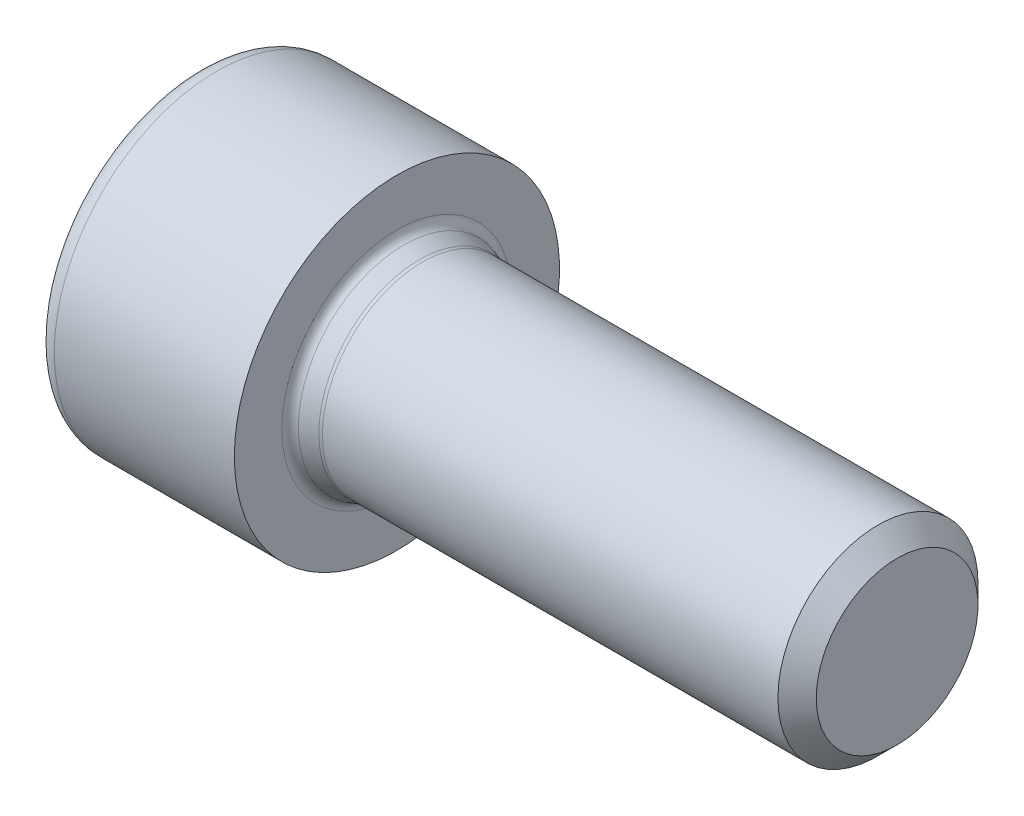
ISO-10303-21;
HEADER;
FILE_DESCRIPTION(('STEP AP214'),'2;1');
FILE_NAME('part.step','',(''),(''),'','','');
FILE_SCHEMA(('AUTOMOTIVE_DESIGN { 1 0 10303 214 1 1 1 1 }'));
ENDSEC;
DATA;
#1=APPLICATION_CONTEXT('core data for automotive mechanical design processes');
#2=APPLICATION_PROTOCOL_DEFINITION('international standard','automotive_design',2000,#1);
#3=PRODUCT_CONTEXT('',#1,'mechanical');
#4=PRODUCT('Part','Part','',(#3));
#5=PRODUCT_RELATED_PRODUCT_CATEGORY('part','',(#4));
#6=PRODUCT_DEFINITION_FORMATION('','',#4);
#7=PRODUCT_DEFINITION_CONTEXT('part definition',#1,'design');
#8=PRODUCT_DEFINITION('design','',#6,#7);
#9=PRODUCT_DEFINITION_SHAPE('','',#8);
#10=(LENGTH_UNIT() NAMED_UNIT(*) SI_UNIT(.MILLI.,.METRE.));
#11=(NAMED_UNIT(*) PLANE_ANGLE_UNIT() SI_UNIT($,.RADIAN.));
#12=(NAMED_UNIT(*) SI_UNIT($,.STERADIAN.) SOLID_ANGLE_UNIT());
#13=UNCERTAINTY_MEASURE_WITH_UNIT(LENGTH_MEASURE(1.E-05),#10,'distance_accuracy_value','');
#14=(GEOMETRIC_REPRESENTATION_CONTEXT(3) GLOBAL_UNCERTAINTY_ASSIGNED_CONTEXT((#13)) GLOBAL_UNIT_ASSIGNED_CONTEXT((#10,
#11,#12)) REPRESENTATION_CONTEXT('',''));
#15=CARTESIAN_POINT('',(0.,0.,0.));
#16=DIRECTION('',(0.,0.,1.));
#17=DIRECTION('',(1.,0.,0.));
#18=AXIS2_PLACEMENT_3D('',#15,#16,#17);
#19=CARTESIAN_POINT('',(-4.,3.,0.));
#20=DIRECTION('',(-1.,0.,0.));
#21=DIRECTION('',(0.,0.,1.));
#22=AXIS2_PLACEMENT_3D('',#19,#20,#21);
#23=PLANE('',#22);
#24=CARTESIAN_POINT('',(-4.0000000000191,0.,0.));
#25=DIRECTION('',(-1.,0.,0.));
#26=DIRECTION('',(0.,0.,1.));
#27=AXIS2_PLACEMENT_3D('',#24,#25,#26);
#28=CIRCLE('',#27,2.99999999992906);
#29=CARTESIAN_POINT('',(-4.00000000000955,0.,2.99999999996453));
#30=VERTEX_POINT('',#29);
#31=CARTESIAN_POINT('',(-4.00000000000955,-2.5980762113226,1.49999999998226));
#32=VERTEX_POINT('',#31);
#33=EDGE_CURVE('E18',#30,#32,#28,.F.);
#34=ORIENTED_EDGE('',*,*,#33,.T.);
#35=DIRECTION('',(0.,0.500000000000001,0.866025403784438));
#36=VECTOR('',#35,1.);
#37=CARTESIAN_POINT('',(-4.,-2.59807621135332,1.5));
#38=LINE('',#37,#36);
#39=CARTESIAN_POINT('',(-4.,-1.73205080756888,3.));
#40=VERTEX_POINT('',#39);
#41=EDGE_CURVE('E120',#32,#40,#38,.T.);
#42=ORIENTED_EDGE('',*,*,#41,.T.);
#43=DIRECTION('',(0.,1.,0.));
#44=VECTOR('',#43,1.);
#45=CARTESIAN_POINT('',(-4.,3.,3.));
#46=LINE('',#45,#44);
#47=EDGE_CURVE('E89',#40,#30,#46,.T.);
#48=ORIENTED_EDGE('',*,*,#47,.T.);
#49=EDGE_LOOP('',(#34,#42,#48));
#50=FACE_BOUND('',#49,.T.);
#51=ADVANCED_FACE('F15',(#50),#23,.T.);
#52=CARTESIAN_POINT('',(-4.,3.,0.));
#53=DIRECTION('',(-1.,0.,0.));
#54=DIRECTION('',(0.,0.,1.));
#55=AXIS2_PLACEMENT_3D('',#52,#53,#54);
#56=PLANE('',#55);
#57=CARTESIAN_POINT('',(-4.0000000000191,0.,0.));
#58=DIRECTION('',(-1.,0.,0.));
#59=DIRECTION('',(0.,0.,1.));
#60=AXIS2_PLACEMENT_3D('',#57,#58,#59);
#61=CIRCLE('',#60,2.99999999992906);
#62=CARTESIAN_POINT('',(-4.00000000000955,-2.5980762113226,-1.49999999998226));
#63=VERTEX_POINT('',#62);
#64=EDGE_CURVE('E424',#32,#63,#61,.F.);
#65=ORIENTED_EDGE('',*,*,#64,.T.);
#66=DIRECTION('',(0.,-0.499999999999996,0.866025403784441));
#67=VECTOR('',#66,1.);
#68=CARTESIAN_POINT('',(-4.,-2.59807621135332,-1.5));
#69=LINE('',#68,#67);
#70=CARTESIAN_POINT('',(-4.,-3.46410161513775,0.));
#71=VERTEX_POINT('',#70);
#72=EDGE_CURVE('E131',#63,#71,#69,.T.);
#73=ORIENTED_EDGE('',*,*,#72,.T.);
#74=DIRECTION('',(0.,0.499999999999996,0.866025403784441));
#75=VECTOR('',#74,1.);
#76=CARTESIAN_POINT('',(-4.,-3.46410161513775,0.));
#77=LINE('',#76,#75);
#78=EDGE_CURVE('E129',#71,#32,#77,.T.);
#79=ORIENTED_EDGE('',*,*,#78,.T.);
#80=EDGE_LOOP('',(#65,#73,#79));
#81=FACE_BOUND('',#80,.T.);
#82=ADVANCED_FACE('F269',(#81),#56,.T.);
#83=CARTESIAN_POINT('',(-4.,3.,0.));
#84=DIRECTION('',(-1.,0.,0.));
#85=DIRECTION('',(0.,0.,1.));
#86=AXIS2_PLACEMENT_3D('',#83,#84,#85);
#87=PLANE('',#86);
#88=CARTESIAN_POINT('',(-4.0000000000191,0.,0.));
#89=DIRECTION('',(-1.,0.,0.));
#90=DIRECTION('',(0.,0.,1.));
#91=AXIS2_PLACEMENT_3D('',#88,#89,#90);
#92=CIRCLE('',#91,2.99999999992906);
#93=CARTESIAN_POINT('',(-4.00000000000955,0.,-2.99999999996453));
#94=VERTEX_POINT('',#93);
#95=EDGE_CURVE('E458',#63,#94,#92,.F.);
#96=ORIENTED_EDGE('',*,*,#95,.T.);
#97=DIRECTION('',(0.,1.,0.));
#98=VECTOR('',#97,1.);
#99=CARTESIAN_POINT('',(-4.,3.,-3.));
#100=LINE('',#99,#98);
#101=CARTESIAN_POINT('',(-4.,-1.73205080756888,-3.));
#102=VERTEX_POINT('',#101);
#103=EDGE_CURVE('E417',#94,#102,#100,.F.);
#104=ORIENTED_EDGE('',*,*,#103,.T.);
#105=DIRECTION('',(0.,-0.500000000000001,0.866025403784438));
#106=VECTOR('',#105,1.);
#107=CARTESIAN_POINT('',(-4.,-1.73205080756888,-3.));
#108=LINE('',#107,#106);
#109=EDGE_CURVE('E420',#102,#63,#108,.T.);
#110=ORIENTED_EDGE('',*,*,#109,.T.);
#111=EDGE_LOOP('',(#96,#104,#110));
#112=FACE_BOUND('',#111,.T.);
#113=ADVANCED_FACE('F266',(#112),#87,.T.);
#114=CARTESIAN_POINT('',(-4.,3.,0.));
#115=DIRECTION('',(-1.,0.,0.));
#116=DIRECTION('',(0.,0.,1.));
#117=AXIS2_PLACEMENT_3D('',#114,#115,#116);
#118=PLANE('',#117);
#119=CARTESIAN_POINT('',(-4.0000000000191,0.,0.));
#120=DIRECTION('',(-1.,0.,0.));
#121=DIRECTION('',(0.,0.,1.));
#122=AXIS2_PLACEMENT_3D('',#119,#120,#121);
#123=CIRCLE('',#122,2.99999999992906);
#124=CARTESIAN_POINT('',(-4.00000000000955,2.5980762113226,-1.49999999998226));
#125=VERTEX_POINT('',#124);
#126=EDGE_CURVE('E453',#94,#125,#123,.F.);
#127=ORIENTED_EDGE('',*,*,#126,.T.);
#128=DIRECTION('',(0.,-0.500000000000001,-0.866025403784438));
#129=VECTOR('',#128,1.);
#130=CARTESIAN_POINT('',(-4.,2.59807621135332,-1.5));
#131=LINE('',#130,#129);
#132=CARTESIAN_POINT('',(-4.,1.73205080756888,-3.));
#133=VERTEX_POINT('',#132);
#134=EDGE_CURVE('E411',#125,#133,#131,.T.);
#135=ORIENTED_EDGE('',*,*,#134,.T.);
#136=DIRECTION('',(0.,1.,0.));
#137=VECTOR('',#136,1.);
#138=CARTESIAN_POINT('',(-4.,3.,-3.));
#139=LINE('',#138,#137);
#140=EDGE_CURVE('E414',#133,#94,#139,.F.);
#141=ORIENTED_EDGE('',*,*,#140,.T.);
#142=EDGE_LOOP('',(#127,#135,#141));
#143=FACE_BOUND('',#142,.T.);
#144=ADVANCED_FACE('F262',(#143),#118,.T.);
#145=CARTESIAN_POINT('',(-4.,3.,0.));
#146=DIRECTION('',(-1.,0.,0.));
#147=DIRECTION('',(0.,0.,1.));
#148=AXIS2_PLACEMENT_3D('',#145,#146,#147);
#149=PLANE('',#148);
#150=CARTESIAN_POINT('',(-4.0000000000191,0.,0.));
#151=DIRECTION('',(-1.,0.,0.));
#152=DIRECTION('',(0.,0.,1.));
#153=AXIS2_PLACEMENT_3D('',#150,#151,#152);
#154=CIRCLE('',#153,2.99999999992906);
#155=CARTESIAN_POINT('',(-4.00000000000955,2.5980762113226,1.49999999998226));
#156=VERTEX_POINT('',#155);
#157=EDGE_CURVE('E452',#125,#156,#154,.F.);
#158=ORIENTED_EDGE('',*,*,#157,.T.);
#159=DIRECTION('',(0.,0.499999999999996,-0.866025403784441));
#160=VECTOR('',#159,1.);
#161=CARTESIAN_POINT('',(-4.,2.59807621135332,1.5));
#162=LINE('',#161,#160);
#163=CARTESIAN_POINT('',(-4.,3.46410161513775,0.));
#164=VERTEX_POINT('',#163);
#165=EDGE_CURVE('E405',#156,#164,#162,.T.);
#166=ORIENTED_EDGE('',*,*,#165,.T.);
#167=DIRECTION('',(0.,-0.499999999999996,-0.866025403784441));
#168=VECTOR('',#167,1.);
#169=CARTESIAN_POINT('',(-4.,3.46410161513775,0.));
#170=LINE('',#169,#168);
#171=EDGE_CURVE('E408',#164,#125,#170,.T.);
#172=ORIENTED_EDGE('',*,*,#171,.T.);
#173=EDGE_LOOP('',(#158,#166,#172));
#174=FACE_BOUND('',#173,.T.);
#175=ADVANCED_FACE('F259',(#174),#149,.T.);
#176=CARTESIAN_POINT('',(-4.0000000000191,0.,0.));
#177=DIRECTION('',(-1.,0.,0.));
#178=DIRECTION('',(0.,0.,1.));
#179=AXIS2_PLACEMENT_3D('',#176,#177,#178);
#180=CONICAL_SURFACE('',#179,2.99999999992906,1.04719755118004);
#181=CARTESIAN_POINT('',(-2.26794919245776,0.,-5.6843418860808E-11));
#182=VERTEX_POINT('',#181);
#183=VERTEX_LOOP('',#182);
#184=FACE_BOUND('',#183,.T.);
#185=ORIENTED_EDGE('',*,*,#157,.F.);
#186=ORIENTED_EDGE('',*,*,#126,.F.);
#187=ORIENTED_EDGE('',*,*,#95,.F.);
#188=ORIENTED_EDGE('',*,*,#64,.F.);
#189=ORIENTED_EDGE('',*,*,#33,.F.);
#190=CARTESIAN_POINT('',(-4.0000000000191,0.,0.));
#191=DIRECTION('',(-1.,0.,0.));
#192=DIRECTION('',(0.,0.,1.));
#193=AXIS2_PLACEMENT_3D('',#190,#191,#192);
#194=CIRCLE('',#193,2.99999999992906);
#195=EDGE_CURVE('E392',#156,#30,#194,.F.);
#196=ORIENTED_EDGE('',*,*,#195,.F.);
#197=EDGE_LOOP('',(#185,#186,#187,#188,#189,#196));
#198=FACE_BOUND('',#197,.T.);
#199=ADVANCED_FACE('F255',(#184,#198),#180,.F.);
#200=CARTESIAN_POINT('',(-4.,3.,0.));
#201=DIRECTION('',(-1.,0.,0.));
#202=DIRECTION('',(0.,0.,1.));
#203=AXIS2_PLACEMENT_3D('',#200,#201,#202);
#204=PLANE('',#203);
#205=ORIENTED_EDGE('',*,*,#195,.T.);
#206=DIRECTION('',(0.,1.,0.));
#207=VECTOR('',#206,1.);
#208=CARTESIAN_POINT('',(-4.,1.73205080756888,3.));
#209=LINE('',#208,#207);
#210=CARTESIAN_POINT('',(-4.,1.73205080756887,3.));
#211=VERTEX_POINT('',#210);
#212=EDGE_CURVE('E119',#211,#30,#209,.F.);
#213=ORIENTED_EDGE('',*,*,#212,.F.);
#214=DIRECTION('',(0.,0.5,-0.866025403784439));
#215=VECTOR('',#214,1.);
#216=CARTESIAN_POINT('',(-4.,3.46410161513775,0.));
#217=LINE('',#216,#215);
#218=EDGE_CURVE('E386',#156,#211,#217,.F.);
#219=ORIENTED_EDGE('',*,*,#218,.F.);
#220=EDGE_LOOP('',(#205,#213,#219));
#221=FACE_BOUND('',#220,.T.);
#222=ADVANCED_FACE('F252',(#221),#204,.T.);
#223=CARTESIAN_POINT('',(-4.,1.73205080756888,3.));
#224=DIRECTION('',(0.,0.,-1.));
#225=DIRECTION('',(-1.,0.,0.));
#226=AXIS2_PLACEMENT_3D('',#223,#224,#225);
#227=PLANE('',#226);
#228=DIRECTION('',(1.,0.,0.));
#229=VECTOR('',#228,1.);
#230=CARTESIAN_POINT('',(-4.,-1.73205080756888,3.));
#231=LINE('',#230,#229);
#232=CARTESIAN_POINT('',(-8.,-1.73205080756888,3.));
#233=VERTEX_POINT('',#232);
#234=EDGE_CURVE('E116',#233,#40,#231,.T.);
#235=ORIENTED_EDGE('',*,*,#234,.F.);
#236=DIRECTION('',(0.,1.,0.));
#237=VECTOR('',#236,1.);
#238=CARTESIAN_POINT('',(-8.,1.73205080756888,3.));
#239=LINE('',#238,#237);
#240=CARTESIAN_POINT('',(-7.99999999997347,-1.70367250385387,3.));
#241=VERTEX_POINT('',#240);
#242=EDGE_CURVE('E387',#233,#241,#239,.T.);
#243=ORIENTED_EDGE('',*,*,#242,.T.);
#244=CARTESIAN_POINT('',(-7.99999999995127,-1.70367250375957,2.99999999999281));
#245=CARTESIAN_POINT('',(-7.95671685828273,-1.55192185208025,2.99999999999742));
#246=CARTESIAN_POINT('',(-7.91745605115546,-1.39886053079033,2.99999999999931));
#247=CARTESIAN_POINT('',(-7.8491630909176,-1.09012722809314,3.00000000000069));
#248=CARTESIAN_POINT('',(-7.82015468316097,-0.934450049708204,3.00000000000018));
#249=CARTESIAN_POINT('',(-7.77532313325665,-0.625011039735471,2.99999999999982));
#250=CARTESIAN_POINT('',(-7.75919615039618,-0.471294863960264,2.99999999999995));
#251=CARTESIAN_POINT('',(-7.74050382446883,-0.163195977916186,3.00000000000005));
#252=CARTESIAN_POINT('',(-7.73792240439526,-0.00881427556241422,3.00000000000001));
#253=CARTESIAN_POINT('',(-7.74586645183989,0.275884849495971,2.99999999999999));
#254=CARTESIAN_POINT('',(-7.75444245255764,0.406261618517005,3.));
#255=CARTESIAN_POINT('',(-7.78084221443549,0.666172624762333,3.));
#256=CARTESIAN_POINT('',(-7.79867373067226,0.795706063069744,3.));
#257=CARTESIAN_POINT('',(-7.84294305446773,1.05608764301724,3.));
#258=CARTESIAN_POINT('',(-7.86955547930855,1.18690534401026,3.));
#259=CARTESIAN_POINT('',(-7.92983545276018,1.44666896963056,3.));
#260=CARTESIAN_POINT('',(-7.9634902095352,1.57561784085736,3.));
#261=CARTESIAN_POINT('',(-7.99999999994662,1.7036725037597,3.));
#262=B_SPLINE_CURVE_WITH_KNOTS('',3,(#244,#245,#246,#247,#248,#249,#250,#251,#252,#253,#254,
#255,#256,#257,#258,#259,#260,#261),.UNSPECIFIED.,.F.,.F.,(4,2,2,2,2,2,2,2,4),(0.,
0.473592249569258,0.948274296359578,1.4113986726604,1.87397324968782,2.26560334473621,
2.65756211254792,3.05783929928676,3.45739562947679),.UNSPECIFIED.);
#263=CARTESIAN_POINT('',(-7.99999999997347,1.70367250385387,3.));
#264=VERTEX_POINT('',#263);
#265=EDGE_CURVE('E238',#241,#264,#262,.T.);
#266=ORIENTED_EDGE('',*,*,#265,.T.);
#267=DIRECTION('',(0.,1.,0.));
#268=VECTOR('',#267,1.);
#269=CARTESIAN_POINT('',(-8.,1.73205080756888,3.));
#270=LINE('',#269,#268);
#271=CARTESIAN_POINT('',(-8.,1.73205080756888,3.));
#272=VERTEX_POINT('',#271);
#273=EDGE_CURVE('E389',#264,#272,#270,.T.);
#274=ORIENTED_EDGE('',*,*,#273,.T.);
#275=DIRECTION('',(1.,0.,0.));
#276=VECTOR('',#275,1.);
#277=CARTESIAN_POINT('',(-4.,1.73205080756887,3.));
#278=LINE('',#277,#276);
#279=EDGE_CURVE('E382',#211,#272,#278,.F.);
#280=ORIENTED_EDGE('',*,*,#279,.F.);
#281=ORIENTED_EDGE('',*,*,#212,.T.);
#282=ORIENTED_EDGE('',*,*,#47,.F.);
#283=EDGE_LOOP('',(#235,#243,#266,#274,#280,#281,#282));
#284=FACE_BOUND('',#283,.T.);
#285=ADVANCED_FACE('F114',(#284),#227,.T.);
#286=CARTESIAN_POINT('',(-4.,3.46410161513775,0.));
#287=DIRECTION('',(0.,-0.866025403784439,-0.5));
#288=DIRECTION('',(0.,0.5,-0.866025403784439));
#289=AXIS2_PLACEMENT_3D('',#286,#287,#288);
#290=PLANE('',#289);
#291=ORIENTED_EDGE('',*,*,#279,.T.);
#292=DIRECTION('',(0.,0.5,-0.866025403784439));
#293=VECTOR('',#292,1.);
#294=CARTESIAN_POINT('',(-8.,3.46410161513775,0.));
#295=LINE('',#294,#293);
#296=CARTESIAN_POINT('',(-7.99999999997347,1.74623995942638,2.9754236680665));
#297=VERTEX_POINT('',#296);
#298=EDGE_CURVE('E380',#272,#297,#295,.T.);
#299=ORIENTED_EDGE('',*,*,#298,.T.);
#300=CARTESIAN_POINT('',(-7.99999999995127,1.74623995946731,2.97542366798123));
#301=CARTESIAN_POINT('',(-7.95671685828368,1.82211528531081,2.84400374858864));
#302=CARTESIAN_POINT('',(-7.91745605115728,1.89864594595725,2.71144875601599));
#303=CARTESIAN_POINT('',(-7.84916309092093,2.05301259730665,2.44407787288732));
#304=CARTESIAN_POINT('',(-7.82015468316493,2.13085118649845,2.30925748161661));
#305=CARTESIAN_POINT('',(-7.7753231332615,2.2855706914841,2.04127543805884));
#306=CARTESIAN_POINT('',(-7.75919615040131,2.36242877937164,1.9081533248653));
#307=CARTESIAN_POINT('',(-7.74050382447419,2.51647822239339,1.64133186267413));
#308=CARTESIAN_POINT('',(-7.73792240440057,2.59366907357005,1.50763338655658));
#309=CARTESIAN_POINT('',(-7.74586645184479,2.73601863609922,1.26107671182083));
#310=CARTESIAN_POINT('',(-7.75444245256229,2.80120702060992,1.14816711778497));
#311=CARTESIAN_POINT('',(-7.78084221443952,2.93116252373296,0.923077583652704));
#312=CARTESIAN_POINT('',(-7.79867373067591,2.99592924288685,0.810898335438607));
#313=CARTESIAN_POINT('',(-7.84294305447052,3.12612003286096,0.585401272525912));
#314=CARTESIAN_POINT('',(-7.86955547931084,3.19152888335765,0.472109820200983));
#315=CARTESIAN_POINT('',(-7.92983545276138,3.32141069616817,0.247147921434006));
#316=CARTESIAN_POINT('',(-7.96349020953581,3.38588513178178,0.135474923161914));
#317=CARTESIAN_POINT('',(-7.99999999994662,3.44991246323316,0.0245763320150588));
#318=B_SPLINE_CURVE_WITH_KNOTS('',3,(#300,#301,#302,#303,#304,#305,#306,#307,#308,#309,#310,
#311,#312,#313,#314,#315,#316,#317),.UNSPECIFIED.,.F.,.F.,(4,2,2,2,2,2,2,2,4),(0.,
0.473592249567666,0.948274296356338,1.41139867265603,1.87397324968234,2.26560334473175,
2.65756211254446,3.05783929928402,3.4573956294748),.UNSPECIFIED.);
#319=CARTESIAN_POINT('',(-7.99999999997347,3.44991246328025,0.0245763319334976));
#320=VERTEX_POINT('',#319);
#321=EDGE_CURVE('E231',#297,#320,#318,.T.);
#322=ORIENTED_EDGE('',*,*,#321,.T.);
#323=DIRECTION('',(0.,0.5,-0.866025403784439));
#324=VECTOR('',#323,1.);
#325=CARTESIAN_POINT('',(-8.,3.46410161513775,0.));
#326=LINE('',#325,#324);
#327=CARTESIAN_POINT('',(-8.,3.46410161513775,0.));
#328=VERTEX_POINT('',#327);
#329=EDGE_CURVE('E383',#320,#328,#326,.T.);
#330=ORIENTED_EDGE('',*,*,#329,.T.);
#331=DIRECTION('',(1.,0.,0.));
#332=VECTOR('',#331,1.);
#333=CARTESIAN_POINT('',(-4.,3.46410161513776,0.));
#334=LINE('',#333,#332);
#335=EDGE_CURVE('E376',#164,#328,#334,.F.);
#336=ORIENTED_EDGE('',*,*,#335,.F.);
#337=ORIENTED_EDGE('',*,*,#165,.F.);
#338=ORIENTED_EDGE('',*,*,#218,.T.);
#339=EDGE_LOOP('',(#291,#299,#322,#330,#336,#337,#338));
#340=FACE_BOUND('',#339,.T.);
#341=ADVANCED_FACE('F245',(#340),#290,.T.);
#342=CARTESIAN_POINT('',(-4.,1.73205080756888,-3.));
#343=DIRECTION('',(0.,-0.866025403784439,0.5));
#344=DIRECTION('',(0.,-0.5,-0.866025403784439));
#345=AXIS2_PLACEMENT_3D('',#342,#343,#344);
#346=PLANE('',#345);
#347=ORIENTED_EDGE('',*,*,#335,.T.);
#348=DIRECTION('',(0.,-0.5,-0.866025403784439));
#349=VECTOR('',#348,1.);
#350=CARTESIAN_POINT('',(-8.,1.73205080756888,-3.));
#351=LINE('',#350,#349);
#352=CARTESIAN_POINT('',(-7.99999999997347,3.44991246328025,-0.0245763319335048));
#353=VERTEX_POINT('',#352);
#354=EDGE_CURVE('E374',#328,#353,#351,.T.);
#355=ORIENTED_EDGE('',*,*,#354,.T.);
#356=CARTESIAN_POINT('',(-7.99999999995127,3.44991246322688,-0.0245763320115805));
#357=CARTESIAN_POINT('',(-7.95671685828139,3.37403713739101,-0.155996251409351));
#358=CARTESIAN_POINT('',(-7.91745605115288,3.29750647674745,-0.288551243984587));
#359=CARTESIAN_POINT('',(-7.8491630909129,3.14313982539951,-0.555922127116271));
#360=CARTESIAN_POINT('',(-7.82015468315538,3.06530123620628,-0.690742518387399));
#361=CARTESIAN_POINT('',(-7.77532313324979,2.91058173121903,-0.958724561946503));
#362=CARTESIAN_POINT('',(-7.75919615038891,2.83372364333129,-1.09184667514093));
#363=CARTESIAN_POINT('',(-7.74050382446124,2.67967420030881,-1.35866813733375));
#364=CARTESIAN_POINT('',(-7.73792240438776,2.60248334913162,-1.49236661345205));
#365=CARTESIAN_POINT('',(-7.74586645183297,2.46013378660239,-1.73892328818783));
#366=CARTESIAN_POINT('',(-7.75444245255106,2.39494540209213,-1.85183288222295));
#367=CARTESIAN_POINT('',(-7.7808422144298,2.26498989897,-2.07692241635368));
#368=CARTESIAN_POINT('',(-7.79867373066709,2.20022317981656,-2.18910166456697));
#369=CARTESIAN_POINT('',(-7.84294305446379,2.07003238984333,-2.41459872747814));
#370=CARTESIAN_POINT('',(-7.86955547930532,2.00462353934706,-2.52789017980234));
#371=CARTESIAN_POINT('',(-7.92983545275849,1.87474172653745,-2.75285207856775));
#372=CARTESIAN_POINT('',(-7.96349020953433,1.81026729092433,-2.86452507683899));
#373=CARTESIAN_POINT('',(-7.99999999994662,1.74623995947347,-2.97542366798494));
#374=B_SPLINE_CURVE_WITH_KNOTS('',3,(#356,#357,#358,#359,#360,#361,#362,#363,#364,#365,#366,
#367,#368,#369,#370,#371,#372,#373),.UNSPECIFIED.,.F.,.F.,(4,2,2,2,2,2,2,2,4),(0.,
0.473592249571507,0.948274296364157,1.41139867266659,1.87397324969557,2.26560334474252,
2.65756211255281,3.05783929929064,3.45739562947961),.UNSPECIFIED.);
#375=CARTESIAN_POINT('',(-7.99999999997347,1.74623995942638,-2.9754236680665));
#376=VERTEX_POINT('',#375);
#377=EDGE_CURVE('E210',#353,#376,#374,.T.);
#378=ORIENTED_EDGE('',*,*,#377,.T.);
#379=DIRECTION('',(0.,-0.5,-0.866025403784439));
#380=VECTOR('',#379,1.);
#381=CARTESIAN_POINT('',(-8.,1.73205080756888,-3.));
#382=LINE('',#381,#380);
#383=CARTESIAN_POINT('',(-8.,1.73205080756888,-3.));
#384=VERTEX_POINT('',#383);
#385=EDGE_CURVE('E377',#376,#384,#382,.T.);
#386=ORIENTED_EDGE('',*,*,#385,.T.);
#387=DIRECTION('',(1.,0.,0.));
#388=VECTOR('',#387,1.);
#389=CARTESIAN_POINT('',(-4.,1.73205080756888,-3.));
#390=LINE('',#389,#388);
#391=EDGE_CURVE('E370',#133,#384,#390,.F.);
#392=ORIENTED_EDGE('',*,*,#391,.F.);
#393=ORIENTED_EDGE('',*,*,#134,.F.);
#394=ORIENTED_EDGE('',*,*,#171,.F.);
#395=EDGE_LOOP('',(#347,#355,#378,#386,#392,#393,#394));
#396=FACE_BOUND('',#395,.T.);
#397=ADVANCED_FACE('F198',(#396),#346,.T.);
#398=CARTESIAN_POINT('',(-4.,-1.73205080756888,-3.));
#399=DIRECTION('',(0.,0.,1.));
#400=DIRECTION('',(1.,0.,0.));
#401=AXIS2_PLACEMENT_3D('',#398,#399,#400);
#402=PLANE('',#401);
#403=ORIENTED_EDGE('',*,*,#391,.T.);
#404=DIRECTION('',(0.,1.,0.));
#405=VECTOR('',#404,1.);
#406=CARTESIAN_POINT('',(-8.,-1.73205080756888,-3.));
#407=LINE('',#406,#405);
#408=CARTESIAN_POINT('',(-7.99999999997347,1.70367250385387,-3.));
#409=VERTEX_POINT('',#408);
#410=EDGE_CURVE('E368',#384,#409,#407,.F.);
#411=ORIENTED_EDGE('',*,*,#410,.T.);
#412=CARTESIAN_POINT('',(-7.99999999995127,1.70367250375957,-2.99999999999281));
#413=CARTESIAN_POINT('',(-7.95671685828063,1.55192185207964,-2.99999999999742));
#414=CARTESIAN_POINT('',(-7.91745605115143,1.39886053078899,-2.99999999999931));
#415=CARTESIAN_POINT('',(-7.84916309091025,1.09012722809007,-3.00000000000069));
#416=CARTESIAN_POINT('',(-7.82015468315222,0.934450049704151,-3.00000000000018));
#417=CARTESIAN_POINT('',(-7.77532313324591,0.625011039729625,-2.99999999999982));
#418=CARTESIAN_POINT('',(-7.75919615038481,0.471294863953622,-2.99999999999995));
#419=CARTESIAN_POINT('',(-7.74050382445696,0.163195977907908,-3.00000000000005));
#420=CARTESIAN_POINT('',(-7.73792240438353,0.00881427555329589,-3.00000000000001));
#421=CARTESIAN_POINT('',(-7.74586645182906,-0.275884849505137,-2.99999999999999));
#422=CARTESIAN_POINT('',(-7.75444245254735,-0.40626161852539,-3.));
#423=CARTESIAN_POINT('',(-7.78084221442658,-0.666172624769085,-3.));
#424=CARTESIAN_POINT('',(-7.79867373066417,-0.795706063075642,-3.));
#425=CARTESIAN_POINT('',(-7.84294305446157,-1.05608764302153,-3.));
#426=CARTESIAN_POINT('',(-7.8695554793035,-1.18690534401379,-3.));
#427=CARTESIAN_POINT('',(-7.92983545275754,-1.44666896963242,-3.));
#428=CARTESIAN_POINT('',(-7.96349020953384,-1.57561784085832,-3.));
#429=CARTESIAN_POINT('',(-7.99999999994662,-1.7036725037597,-3.));
#430=B_SPLINE_CURVE_WITH_KNOTS('',3,(#412,#413,#414,#415,#416,#417,#418,#419,#420,#421,#422,
#423,#424,#425,#426,#427,#428,#429),.UNSPECIFIED.,.F.,.F.,(4,2,2,2,2,2,2,2,4),(0.,
0.473592249572775,0.948274296366738,1.41139867267007,1.87397324969994,2.26560334474608,
2.65756211255557,3.05783929929283,3.4573956294812),.UNSPECIFIED.);
#431=CARTESIAN_POINT('',(-7.99999999997347,-1.70367250385387,-3.));
#432=VERTEX_POINT('',#431);
#433=EDGE_CURVE('E202',#409,#432,#430,.T.);
#434=ORIENTED_EDGE('',*,*,#433,.T.);
#435=DIRECTION('',(0.,1.,0.));
#436=VECTOR('',#435,1.);
#437=CARTESIAN_POINT('',(-8.,-1.73205080756888,-3.));
#438=LINE('',#437,#436);
#439=CARTESIAN_POINT('',(-8.,-1.73205080756888,-3.));
#440=VERTEX_POINT('',#439);
#441=EDGE_CURVE('E371',#432,#440,#438,.F.);
#442=ORIENTED_EDGE('',*,*,#441,.T.);
#443=DIRECTION('',(1.,0.,0.));
#444=VECTOR('',#443,1.);
#445=CARTESIAN_POINT('',(-4.,-1.73205080756887,-3.));
#446=LINE('',#445,#444);
#447=EDGE_CURVE('E364',#102,#440,#446,.F.);
#448=ORIENTED_EDGE('',*,*,#447,.F.);
#449=ORIENTED_EDGE('',*,*,#103,.F.);
#450=ORIENTED_EDGE('',*,*,#140,.F.);
#451=EDGE_LOOP('',(#403,#411,#434,#442,#448,#449,#450));
#452=FACE_BOUND('',#451,.T.);
#453=ADVANCED_FACE('F193',(#452),#402,.T.);
#454=CARTESIAN_POINT('',(-4.,-3.46410161513775,0.));
#455=DIRECTION('',(0.,0.866025403784439,0.5));
#456=DIRECTION('',(0.,-0.5,0.866025403784439));
#457=AXIS2_PLACEMENT_3D('',#454,#455,#456);
#458=PLANE('',#457);
#459=ORIENTED_EDGE('',*,*,#447,.T.);
#460=DIRECTION('',(0.,-0.5,0.866025403784439));
#461=VECTOR('',#460,1.);
#462=CARTESIAN_POINT('',(-8.,-3.46410161513775,0.));
#463=LINE('',#462,#461);
#464=CARTESIAN_POINT('',(-7.99999999997347,-1.74623995942637,-2.9754236680665));
#465=VERTEX_POINT('',#464);
#466=EDGE_CURVE('E362',#440,#465,#463,.T.);
#467=ORIENTED_EDGE('',*,*,#466,.T.);
#468=CARTESIAN_POINT('',(-7.99999999995127,-1.74623995946731,-2.97542366798123));
#469=CARTESIAN_POINT('',(-7.95671685828368,-1.82211528531081,-2.84400374858864));
#470=CARTESIAN_POINT('',(-7.91745605115728,-1.89864594595725,-2.71144875601599));
#471=CARTESIAN_POINT('',(-7.84916309092093,-2.05301259730665,-2.44407787288732));
#472=CARTESIAN_POINT('',(-7.82015468316493,-2.13085118649845,-2.30925748161662));
#473=CARTESIAN_POINT('',(-7.7753231332615,-2.2855706914841,-2.04127543805884));
#474=CARTESIAN_POINT('',(-7.75919615040131,-2.36242877937164,-1.9081533248653));
#475=CARTESIAN_POINT('',(-7.74050382447419,-2.51647822239339,-1.64133186267413));
#476=CARTESIAN_POINT('',(-7.73792240440057,-2.59366907357005,-1.50763338655658));
#477=CARTESIAN_POINT('',(-7.74586645184479,-2.73601863609922,-1.26107671182083));
#478=CARTESIAN_POINT('',(-7.75444245256229,-2.80120702060992,-1.14816711778497));
#479=CARTESIAN_POINT('',(-7.78084221443952,-2.93116252373296,-0.923077583652705));
#480=CARTESIAN_POINT('',(-7.79867373067591,-2.99592924288685,-0.810898335438607));
#481=CARTESIAN_POINT('',(-7.84294305447052,-3.12612003286096,-0.585401272525913));
#482=CARTESIAN_POINT('',(-7.86955547931084,-3.19152888335765,-0.472109820200984));
#483=CARTESIAN_POINT('',(-7.92983545276138,-3.32141069616817,-0.247147921434006));
#484=CARTESIAN_POINT('',(-7.96349020953581,-3.38588513178178,-0.135474923161915));
#485=CARTESIAN_POINT('',(-7.99999999994662,-3.44991246323316,-0.024576332015059));
#486=B_SPLINE_CURVE_WITH_KNOTS('',3,(#468,#469,#470,#471,#472,#473,#474,#475,#476,#477,#478,
#479,#480,#481,#482,#483,#484,#485),.UNSPECIFIED.,.F.,.F.,(4,2,2,2,2,2,2,2,4),(0.,
0.473592249567667,0.948274296356338,1.41139867265603,1.87397324968234,2.26560334473175,
2.65756211254446,3.05783929928403,3.4573956294748),.UNSPECIFIED.);
#487=CARTESIAN_POINT('',(-7.99999999997347,-3.44991246328025,-0.0245763319334978));
#488=VERTEX_POINT('',#487);
#489=EDGE_CURVE('E172',#465,#488,#486,.T.);
#490=ORIENTED_EDGE('',*,*,#489,.T.);
#491=DIRECTION('',(0.,-0.5,0.866025403784439));
#492=VECTOR('',#491,1.);
#493=CARTESIAN_POINT('',(-8.,-3.46410161513775,0.));
#494=LINE('',#493,#492);
#495=CARTESIAN_POINT('',(-8.,-3.46410161513775,0.));
#496=VERTEX_POINT('',#495);
#497=EDGE_CURVE('E365',#488,#496,#494,.T.);
#498=ORIENTED_EDGE('',*,*,#497,.T.);
#499=DIRECTION('',(1.,0.,0.));
#500=VECTOR('',#499,1.);
#501=CARTESIAN_POINT('',(-4.,-3.46410161513776,0.));
#502=LINE('',#501,#500);
#503=EDGE_CURVE('E126',#71,#496,#502,.F.);
#504=ORIENTED_EDGE('',*,*,#503,.F.);
#505=ORIENTED_EDGE('',*,*,#72,.F.);
#506=ORIENTED_EDGE('',*,*,#109,.F.);
#507=EDGE_LOOP('',(#459,#467,#490,#498,#504,#505,#506));
#508=FACE_BOUND('',#507,.T.);
#509=ADVANCED_FACE('F187',(#508),#458,.T.);
#510=CARTESIAN_POINT('',(-4.,-1.73205080756888,3.));
#511=DIRECTION('',(0.,0.866025403784439,-0.5));
#512=DIRECTION('',(0.,0.5,0.866025403784439));
#513=AXIS2_PLACEMENT_3D('',#510,#511,#512);
#514=PLANE('',#513);
#515=ORIENTED_EDGE('',*,*,#503,.T.);
#516=DIRECTION('',(0.,0.5,0.866025403784439));
#517=VECTOR('',#516,1.);
#518=CARTESIAN_POINT('',(-8.,-1.73205080756888,3.));
#519=LINE('',#518,#517);
#520=CARTESIAN_POINT('',(-7.99999999997347,-3.44991246328025,0.0245763319335047));
#521=VERTEX_POINT('',#520);
#522=EDGE_CURVE('E354',#496,#521,#519,.T.);
#523=ORIENTED_EDGE('',*,*,#522,.T.);
#524=CARTESIAN_POINT('',(-7.99999999995127,-3.44991246322688,0.0245763320115804));
#525=CARTESIAN_POINT('',(-7.95671685828139,-3.37403713739101,0.155996251409351));
#526=CARTESIAN_POINT('',(-7.91745605115288,-3.29750647674745,0.288551243984587));
#527=CARTESIAN_POINT('',(-7.8491630909129,-3.14313982539951,0.555922127116271));
#528=CARTESIAN_POINT('',(-7.82015468315538,-3.06530123620628,0.690742518387399));
#529=CARTESIAN_POINT('',(-7.77532313324979,-2.91058173121903,0.958724561946504));
#530=CARTESIAN_POINT('',(-7.75919615038891,-2.83372364333129,1.09184667514093));
#531=CARTESIAN_POINT('',(-7.74050382446124,-2.67967420030881,1.35866813733375));
#532=CARTESIAN_POINT('',(-7.73792240438776,-2.60248334913162,1.49236661345205));
#533=CARTESIAN_POINT('',(-7.74586645183297,-2.46013378660239,1.73892328818783));
#534=CARTESIAN_POINT('',(-7.75444245255106,-2.39494540209213,1.85183288222295));
#535=CARTESIAN_POINT('',(-7.7808422144298,-2.26498989897,2.07692241635368));
#536=CARTESIAN_POINT('',(-7.79867373066709,-2.20022317981656,2.18910166456697));
#537=CARTESIAN_POINT('',(-7.84294305446379,-2.07003238984333,2.41459872747814));
#538=CARTESIAN_POINT('',(-7.86955547930532,-2.00462353934706,2.52789017980235));
#539=CARTESIAN_POINT('',(-7.92983545275849,-1.87474172653745,2.75285207856775));
#540=CARTESIAN_POINT('',(-7.96349020953433,-1.81026729092433,2.86452507683899));
#541=CARTESIAN_POINT('',(-7.99999999994662,-1.74623995947347,2.97542366798494));
#542=B_SPLINE_CURVE_WITH_KNOTS('',3,(#524,#525,#526,#527,#528,#529,#530,#531,#532,#533,#534,
#535,#536,#537,#538,#539,#540,#541),.UNSPECIFIED.,.F.,.F.,(4,2,2,2,2,2,2,2,4),(0.,
0.473592249571507,0.948274296364157,1.41139867266659,1.87397324969557,2.26560334474252,
2.65756211255281,3.05783929929065,3.45739562947961),.UNSPECIFIED.);
#543=CARTESIAN_POINT('',(-7.99999999997347,-1.74623995942638,2.97542366806649));
#544=VERTEX_POINT('',#543);
#545=EDGE_CURVE('E164',#521,#544,#542,.T.);
#546=ORIENTED_EDGE('',*,*,#545,.T.);
#547=DIRECTION('',(0.,0.5,0.866025403784439));
#548=VECTOR('',#547,1.);
#549=CARTESIAN_POINT('',(-8.,-1.73205080756888,3.));
#550=LINE('',#549,#548);
#551=EDGE_CURVE('E33',#544,#233,#550,.T.);
#552=ORIENTED_EDGE('',*,*,#551,.T.);
#553=ORIENTED_EDGE('',*,*,#234,.T.);
#554=ORIENTED_EDGE('',*,*,#41,.F.);
#555=ORIENTED_EDGE('',*,*,#78,.F.);
#556=EDGE_LOOP('',(#515,#523,#546,#552,#553,#554,#555));
#557=FACE_BOUND('',#556,.T.);
#558=ADVANCED_FACE('F125',(#557),#514,.T.);
#559=CARTESIAN_POINT('',(-7.99999999986767,0.,0.));
#560=DIRECTION('',(-1.,0.,0.));
#561=DIRECTION('',(0.,0.,1.));
#562=AXIS2_PLACEMENT_3D('',#559,#560,#561);
#563=CONICAL_SURFACE('',#562,3.44999999987294,1.04719755122362);
#564=ORIENTED_EDGE('',*,*,#265,.F.);
#565=CARTESIAN_POINT('',(-7.99999999996612,0.,0.));
#566=DIRECTION('',(-1.,0.,0.));
#567=DIRECTION('',(0.,0.,1.));
#568=AXIS2_PLACEMENT_3D('',#565,#566,#567);
#569=CIRCLE('',#568,3.45000000004347);
#570=EDGE_CURVE('E161',#241,#264,#569,.T.);
#571=ORIENTED_EDGE('',*,*,#570,.T.);
#572=EDGE_LOOP('',(#564,#571));
#573=FACE_BOUND('',#572,.T.);
#574=ADVANCED_FACE('F186',(#573),#563,.F.);
#575=CARTESIAN_POINT('',(-7.99999999986767,0.,0.));
#576=DIRECTION('',(-1.,0.,0.));
#577=DIRECTION('',(0.,0.,1.));
#578=AXIS2_PLACEMENT_3D('',#575,#576,#577);
#579=CONICAL_SURFACE('',#578,3.44999999987294,1.04719755123235);
#580=ORIENTED_EDGE('',*,*,#321,.F.);
#581=CARTESIAN_POINT('',(-7.99999999996612,0.,0.));
#582=DIRECTION('',(-1.,0.,0.));
#583=DIRECTION('',(0.,0.,1.));
#584=AXIS2_PLACEMENT_3D('',#581,#582,#583);
#585=CIRCLE('',#584,3.45000000004347);
#586=EDGE_CURVE('E158',#297,#320,#585,.T.);
#587=ORIENTED_EDGE('',*,*,#586,.T.);
#588=EDGE_LOOP('',(#580,#587));
#589=FACE_BOUND('',#588,.T.);
#590=ADVANCED_FACE('F226',(#589),#579,.F.);
#591=CARTESIAN_POINT('',(-7.99999999986767,0.,0.));
#592=DIRECTION('',(-1.,0.,0.));
#593=DIRECTION('',(0.,0.,1.));
#594=AXIS2_PLACEMENT_3D('',#591,#592,#593);
#595=CONICAL_SURFACE('',#594,3.44999999987294,1.04719755121126);
#596=ORIENTED_EDGE('',*,*,#377,.F.);
#597=CARTESIAN_POINT('',(-7.99999999996612,0.,0.));
#598=DIRECTION('',(-1.,0.,0.));
#599=DIRECTION('',(0.,0.,1.));
#600=AXIS2_PLACEMENT_3D('',#597,#598,#599);
#601=CIRCLE('',#600,3.45000000004347);
#602=EDGE_CURVE('E155',#353,#376,#601,.T.);
#603=ORIENTED_EDGE('',*,*,#602,.T.);
#604=EDGE_LOOP('',(#596,#603));
#605=FACE_BOUND('',#604,.T.);
#606=ADVANCED_FACE('F221',(#605),#595,.F.);
#607=CARTESIAN_POINT('',(-7.99999999986767,0.,0.));
#608=DIRECTION('',(-1.,0.,0.));
#609=DIRECTION('',(0.,0.,1.));
#610=AXIS2_PLACEMENT_3D('',#607,#608,#609);
#611=CONICAL_SURFACE('',#610,3.44999999987294,1.0471975512043);
#612=ORIENTED_EDGE('',*,*,#433,.F.);
#613=CARTESIAN_POINT('',(-7.99999999996612,0.,0.));
#614=DIRECTION('',(-1.,0.,0.));
#615=DIRECTION('',(0.,0.,1.));
#616=AXIS2_PLACEMENT_3D('',#613,#614,#615);
#617=CIRCLE('',#616,3.45000000004347);
#618=EDGE_CURVE('E152',#409,#432,#617,.T.);
#619=ORIENTED_EDGE('',*,*,#618,.T.);
#620=EDGE_LOOP('',(#612,#619));
#621=FACE_BOUND('',#620,.T.);
#622=ADVANCED_FACE('F217',(#621),#611,.F.);
#623=CARTESIAN_POINT('',(-7.99999999986767,0.,0.));
#624=DIRECTION('',(-1.,0.,0.));
#625=DIRECTION('',(0.,0.,1.));
#626=AXIS2_PLACEMENT_3D('',#623,#624,#625);
#627=CONICAL_SURFACE('',#626,3.44999999987294,1.04719755123235);
#628=ORIENTED_EDGE('',*,*,#489,.F.);
#629=CARTESIAN_POINT('',(-7.99999999996612,0.,0.));
#630=DIRECTION('',(-1.,0.,0.));
#631=DIRECTION('',(0.,0.,1.));
#632=AXIS2_PLACEMENT_3D('',#629,#630,#631);
#633=CIRCLE('',#632,3.45000000004347);
#634=EDGE_CURVE('E149',#465,#488,#633,.T.);
#635=ORIENTED_EDGE('',*,*,#634,.T.);
#636=EDGE_LOOP('',(#628,#635));
#637=FACE_BOUND('',#636,.T.);
#638=ADVANCED_FACE('F220',(#637),#627,.F.);
#639=CARTESIAN_POINT('',(-7.99999999986767,0.,0.));
#640=DIRECTION('',(-1.,0.,0.));
#641=DIRECTION('',(0.,0.,1.));
#642=AXIS2_PLACEMENT_3D('',#639,#640,#641);
#643=CONICAL_SURFACE('',#642,3.44999999987294,1.04719755121126);
#644=ORIENTED_EDGE('',*,*,#545,.F.);
#645=CARTESIAN_POINT('',(-7.99999999996612,0.,0.));
#646=DIRECTION('',(-1.,0.,0.));
#647=DIRECTION('',(0.,0.,1.));
#648=AXIS2_PLACEMENT_3D('',#645,#646,#647);
#649=CIRCLE('',#648,3.45000000004347);
#650=EDGE_CURVE('E145',#521,#544,#649,.T.);
#651=ORIENTED_EDGE('',*,*,#650,.T.);
#652=EDGE_LOOP('',(#644,#651));
#653=FACE_BOUND('',#652,.T.);
#654=ADVANCED_FACE('F180',(#653),#643,.F.);
#655=CARTESIAN_POINT('',(-8.,0.,0.));
#656=DIRECTION('',(1.,0.,0.));
#657=DIRECTION('',(0.,0.,-1.));
#658=AXIS2_PLACEMENT_3D('',#655,#656,#657);
#659=PLANE('',#658);
#660=ORIENTED_EDGE('',*,*,#551,.F.);
#661=ORIENTED_EDGE('',*,*,#650,.F.);
#662=ORIENTED_EDGE('',*,*,#522,.F.);
#663=ORIENTED_EDGE('',*,*,#497,.F.);
#664=ORIENTED_EDGE('',*,*,#634,.F.);
#665=ORIENTED_EDGE('',*,*,#466,.F.);
#666=ORIENTED_EDGE('',*,*,#441,.F.);
#667=ORIENTED_EDGE('',*,*,#618,.F.);
#668=ORIENTED_EDGE('',*,*,#410,.F.);
#669=ORIENTED_EDGE('',*,*,#385,.F.);
#670=ORIENTED_EDGE('',*,*,#602,.F.);
#671=ORIENTED_EDGE('',*,*,#354,.F.);
#672=ORIENTED_EDGE('',*,*,#329,.F.);
#673=ORIENTED_EDGE('',*,*,#586,.F.);
#674=ORIENTED_EDGE('',*,*,#298,.F.);
#675=ORIENTED_EDGE('',*,*,#273,.F.);
#676=ORIENTED_EDGE('',*,*,#570,.F.);
#677=ORIENTED_EDGE('',*,*,#242,.F.);
#678=EDGE_LOOP('',(#660,#661,#662,#663,#664,#665,#666,#667,#668,#669,#670,#671,#672,#673,#674,
#675,#676,#677));
#679=FACE_BOUND('',#678,.T.);
#680=CARTESIAN_POINT('',(-8.,0.,0.));
#681=DIRECTION('',(1.,0.,0.));
#682=DIRECTION('',(0.,0.,-1.));
#683=AXIS2_PLACEMENT_3D('',#680,#681,#682);
#684=CIRCLE('',#683,5.7);
#685=CARTESIAN_POINT('',(-8.,0.,-5.7));
#686=VERTEX_POINT('',#685);
#687=EDGE_CURVE('E148',#686,#686,#684,.T.);
#688=ORIENTED_EDGE('',*,*,#687,.F.);
#689=EDGE_LOOP('',(#688));
#690=FACE_BOUND('',#689,.T.);
#691=ADVANCED_FACE('F345',(#679,#690),#659,.F.);
#692=CARTESIAN_POINT('',(-7.2,0.,0.));
#693=DIRECTION('',(1.,0.,0.));
#694=DIRECTION('',(0.,0.,-1.));
#695=AXIS2_PLACEMENT_3D('',#692,#693,#694);
#696=TOROIDAL_SURFACE('',#695,5.7,0.8);
#697=CARTESIAN_POINT('',(-7.2,0.,0.));
#698=DIRECTION('',(-1.,0.,0.));
#699=DIRECTION('',(0.,0.,1.));
#700=AXIS2_PLACEMENT_3D('',#697,#698,#699);
#701=CIRCLE('',#700,6.5);
#702=CARTESIAN_POINT('',(-7.2,0.,6.5));
#703=VERTEX_POINT('',#702);
#704=EDGE_CURVE('E144',#703,#703,#701,.F.);
#705=ORIENTED_EDGE('',*,*,#704,.F.);
#706=EDGE_LOOP('',(#705));
#707=FACE_BOUND('',#706,.T.);
#708=ORIENTED_EDGE('',*,*,#687,.T.);
#709=EDGE_LOOP('',(#708));
#710=FACE_BOUND('',#709,.T.);
#711=ADVANCED_FACE('F341',(#707,#710),#696,.T.);
#712=CARTESIAN_POINT('',(20.,0.,0.));
#713=DIRECTION('',(-1.,0.,0.));
#714=DIRECTION('',(0.,0.,1.));
#715=AXIS2_PLACEMENT_3D('',#712,#713,#714);
#716=CYLINDRICAL_SURFACE('',#715,6.5);
#717=ORIENTED_EDGE('',*,*,#704,.T.);
#718=EDGE_LOOP('',(#717));
#719=FACE_BOUND('',#718,.T.);
#720=CARTESIAN_POINT('',(0.,0.,0.));
#721=DIRECTION('',(-1.,0.,0.));
#722=DIRECTION('',(0.,0.,1.));
#723=AXIS2_PLACEMENT_3D('',#720,#721,#722);
#724=CIRCLE('',#723,6.5);
#725=CARTESIAN_POINT('',(0.,0.,6.5));
#726=VERTEX_POINT('',#725);
#727=EDGE_CURVE('E140',#726,#726,#724,.T.);
#728=ORIENTED_EDGE('',*,*,#727,.T.);
#729=EDGE_LOOP('',(#728));
#730=FACE_BOUND('',#729,.T.);
#731=ADVANCED_FACE('F344',(#719,#730),#716,.T.);
#732=CARTESIAN_POINT('',(0.,0.,-6.5));
#733=DIRECTION('',(-1.,0.,0.));
#734=DIRECTION('',(0.,0.,1.));
#735=AXIS2_PLACEMENT_3D('',#732,#733,#734);
#736=PLANE('',#735);
#737=ORIENTED_EDGE('',*,*,#727,.F.);
#738=EDGE_LOOP('',(#737));
#739=FACE_BOUND('',#738,.T.);
#740=CARTESIAN_POINT('',(0.,0.,0.));
#741=DIRECTION('',(1.,0.,0.));
#742=DIRECTION('',(0.,0.,-1.));
#743=AXIS2_PLACEMENT_3D('',#740,#741,#742);
#744=CIRCLE('',#743,4.6);
#745=CARTESIAN_POINT('',(0.,0.,-4.6));
#746=VERTEX_POINT('',#745);
#747=EDGE_CURVE('E143',#746,#746,#744,.F.);
#748=ORIENTED_EDGE('',*,*,#747,.T.);
#749=EDGE_LOOP('',(#748));
#750=FACE_BOUND('',#749,.T.);
#751=ADVANCED_FACE('F317',(#739,#750),#736,.F.);
#752=CARTESIAN_POINT('',(0.4,0.,0.));
#753=DIRECTION('',(1.,0.,0.));
#754=DIRECTION('',(0.,0.,-1.));
#755=AXIS2_PLACEMENT_3D('',#752,#753,#754);
#756=TOROIDAL_SURFACE('',#755,4.6,0.4);
#757=ORIENTED_EDGE('',*,*,#747,.F.);
#758=EDGE_LOOP('',(#757));
#759=FACE_BOUND('',#758,.T.);
#760=CARTESIAN_POINT('',(0.27719888799993,0.,0.));
#761=DIRECTION('',(-1.,0.,0.));
#762=DIRECTION('',(0.,0.,1.));
#763=AXIS2_PLACEMENT_3D('',#760,#761,#762);
#764=CIRCLE('',#763,4.21931655293406);
#765=CARTESIAN_POINT('',(0.27719888799993,0.,4.21931655293406));
#766=VERTEX_POINT('',#765);
#767=EDGE_CURVE('E139',#766,#766,#764,.F.);
#768=ORIENTED_EDGE('',*,*,#767,.F.);
#769=EDGE_LOOP('',(#768));
#770=FACE_BOUND('',#769,.T.);
#771=ADVANCED_FACE('F311',(#759,#770),#756,.F.);
#772=CARTESIAN_POINT('',(20.,0.,-3.233));
#773=DIRECTION('',(-1.,0.,0.));
#774=DIRECTION('',(0.,0.,1.));
#775=AXIS2_PLACEMENT_3D('',#772,#773,#774);
#776=PLANE('',#775);
#777=CARTESIAN_POINT('',(19.9999999999818,0.,0.));
#778=DIRECTION('',(-1.,0.,0.));
#779=DIRECTION('',(0.,0.,1.));
#780=AXIS2_PLACEMENT_3D('',#777,#778,#779);
#781=CIRCLE('',#780,3.23299999996607);
#782=CARTESIAN_POINT('',(19.9999999999818,0.,3.23299999996607));
#783=VERTEX_POINT('',#782);
#784=EDGE_CURVE('E135',#783,#783,#781,.T.);
#785=ORIENTED_EDGE('',*,*,#784,.F.);
#786=EDGE_LOOP('',(#785));
#787=FACE_BOUND('',#786,.T.);
#788=ADVANCED_FACE('F316',(#787),#776,.F.);
#789=CARTESIAN_POINT('',(0.27719888799993,0.,0.));
#790=DIRECTION('',(-1.,0.,0.));
#791=DIRECTION('',(0.,0.,1.));
#792=AXIS2_PLACEMENT_3D('',#789,#790,#791);
#793=CONICAL_SURFACE('',#792,4.21931655293406,0.312042121601375);
#794=CARTESIAN_POINT('',(0.897198888030896,0.,0.));
#795=DIRECTION('',(1.,0.,0.));
#796=DIRECTION('',(0.,0.,-1.));
#797=AXIS2_PLACEMENT_3D('',#794,#795,#796);
#798=CIRCLE('',#797,4.01931655289578);
#799=CARTESIAN_POINT('',(0.897198888030896,0.,-4.01931655289578));
#800=VERTEX_POINT('',#799);
#801=EDGE_CURVE('E138',#800,#800,#798,.F.);
#802=ORIENTED_EDGE('',*,*,#801,.T.);
#803=EDGE_LOOP('',(#802));
#804=FACE_BOUND('',#803,.T.);
#805=ORIENTED_EDGE('',*,*,#767,.T.);
#806=EDGE_LOOP('',(#805));
#807=FACE_BOUND('',#806,.T.);
#808=ADVANCED_FACE('F518',(#804,#807),#793,.T.);
#809=CARTESIAN_POINT('',(19.2329999999856,0.,0.));
#810=DIRECTION('',(-1.,0.,0.));
#811=DIRECTION('',(0.,0.,1.));
#812=AXIS2_PLACEMENT_3D('',#809,#810,#811);
#813=CONICAL_SURFACE('',#812,4.0000000000191,0.785398163434504);
#814=CARTESIAN_POINT('',(19.233,0.,0.));
#815=DIRECTION('',(-1.,0.,0.));
#816=DIRECTION('',(0.,0.,1.));
#817=AXIS2_PLACEMENT_3D('',#814,#815,#816);
#818=CIRCLE('',#817,4.);
#819=CARTESIAN_POINT('',(19.233,0.,4.));
#820=VERTEX_POINT('',#819);
#821=EDGE_CURVE('E24',#820,#820,#818,.T.);
#822=ORIENTED_EDGE('',*,*,#821,.F.);
#823=EDGE_LOOP('',(#822));
#824=FACE_BOUND('',#823,.T.);
#825=ORIENTED_EDGE('',*,*,#784,.T.);
#826=EDGE_LOOP('',(#825));
#827=FACE_BOUND('',#826,.T.);
#828=ADVANCED_FACE('F286',(#824,#827),#813,.T.);
#829=CARTESIAN_POINT('',(1.02,0.,0.));
#830=DIRECTION('',(1.,0.,0.));
#831=DIRECTION('',(0.,0.,-1.));
#832=AXIS2_PLACEMENT_3D('',#829,#830,#831);
#833=TOROIDAL_SURFACE('',#832,4.4,0.4);
#834=ORIENTED_EDGE('',*,*,#801,.F.);
#835=EDGE_LOOP('',(#834));
#836=FACE_BOUND('',#835,.T.);
#837=CARTESIAN_POINT('',(1.02,0.,0.));
#838=DIRECTION('',(-1.,0.,0.));
#839=DIRECTION('',(0.,0.,1.));
#840=AXIS2_PLACEMENT_3D('',#837,#838,#839);
#841=CIRCLE('',#840,4.);
#842=CARTESIAN_POINT('',(1.02,0.,4.));
#843=VERTEX_POINT('',#842);
#844=EDGE_CURVE('E10',#843,#843,#841,.F.);
#845=ORIENTED_EDGE('',*,*,#844,.F.);
#846=EDGE_LOOP('',(#845));
#847=FACE_BOUND('',#846,.T.);
#848=ADVANCED_FACE('F280',(#836,#847),#833,.F.);
#849=CARTESIAN_POINT('',(20.,0.,0.));
#850=DIRECTION('',(-1.,0.,0.));
#851=DIRECTION('',(0.,0.,1.));
#852=AXIS2_PLACEMENT_3D('',#849,#850,#851);
#853=CYLINDRICAL_SURFACE('',#852,4.);
#854=ORIENTED_EDGE('',*,*,#844,.T.);
#855=EDGE_LOOP('',(#854));
#856=FACE_BOUND('',#855,.T.);
#857=ORIENTED_EDGE('',*,*,#821,.T.);
#858=EDGE_LOOP('',(#857));
#859=FACE_BOUND('',#858,.T.);
#860=ADVANCED_FACE('F278',(#856,#859),#853,.T.);
#861=CLOSED_SHELL('',(#51,#82,#113,#144,#175,#199,#222,#285,#341,#397,#453,#509,#558,#574,#590,
#606,#622,#638,#654,#691,#711,#731,#751,#771,#788,#808,#828,#848,#860));
#862=MANIFOLD_SOLID_BREP('B1',#861);
#863=ADVANCED_BREP_SHAPE_REPRESENTATION('',(#18,#862),#14);
#864=SHAPE_DEFINITION_REPRESENTATION(#9,#863);
ENDSEC;
END-ISO-10303-21;
